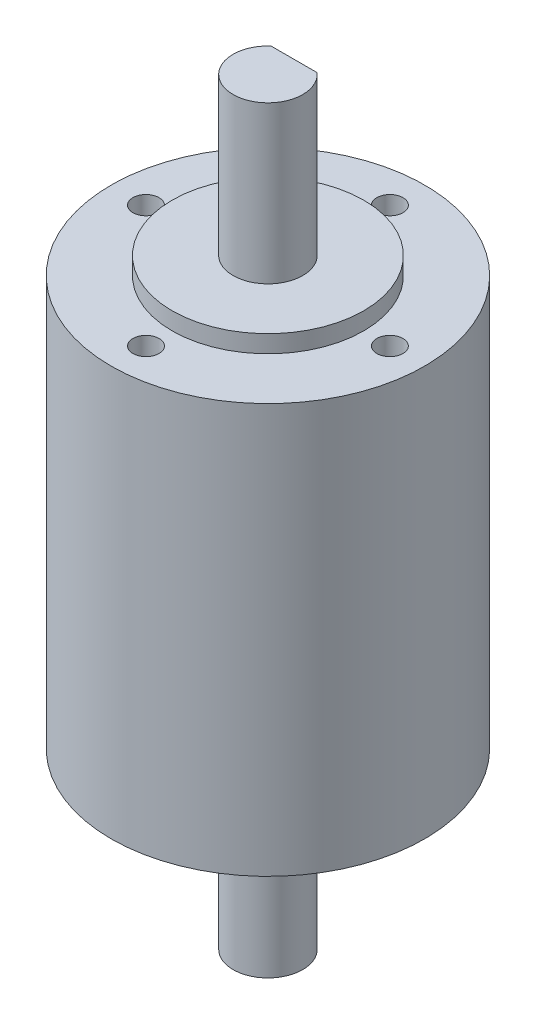
ISO-10303-21;
HEADER;
FILE_DESCRIPTION(('STEP AP214'),'2;1');
FILE_NAME('part.step','',(''),(''),'','','');
FILE_SCHEMA(('AUTOMOTIVE_DESIGN { 1 0 10303 214 1 1 1 1 }'));
ENDSEC;
DATA;
#1=APPLICATION_CONTEXT('core data for automotive mechanical design processes');
#2=APPLICATION_PROTOCOL_DEFINITION('international standard','automotive_design',2000,#1);
#3=PRODUCT_CONTEXT('',#1,'mechanical');
#4=PRODUCT('Part','Part','',(#3));
#5=PRODUCT_RELATED_PRODUCT_CATEGORY('part','',(#4));
#6=PRODUCT_DEFINITION_FORMATION('','',#4);
#7=PRODUCT_DEFINITION_CONTEXT('part definition',#1,'design');
#8=PRODUCT_DEFINITION('design','',#6,#7);
#9=PRODUCT_DEFINITION_SHAPE('','',#8);
#10=(LENGTH_UNIT() NAMED_UNIT(*) SI_UNIT(.MILLI.,.METRE.));
#11=(NAMED_UNIT(*) PLANE_ANGLE_UNIT() SI_UNIT($,.RADIAN.));
#12=(NAMED_UNIT(*) SI_UNIT($,.STERADIAN.) SOLID_ANGLE_UNIT());
#13=UNCERTAINTY_MEASURE_WITH_UNIT(LENGTH_MEASURE(1.E-05),#10,'distance_accuracy_value','');
#14=(GEOMETRIC_REPRESENTATION_CONTEXT(3) GLOBAL_UNCERTAINTY_ASSIGNED_CONTEXT((#13)) GLOBAL_UNIT_ASSIGNED_CONTEXT((#10,
#11,#12)) REPRESENTATION_CONTEXT('',''));
#15=CARTESIAN_POINT('',(0.,0.,0.));
#16=DIRECTION('',(0.,0.,1.));
#17=DIRECTION('',(1.,0.,0.));
#18=AXIS2_PLACEMENT_3D('',#15,#16,#17);
#19=CARTESIAN_POINT('',(0.,47.,0.));
#20=DIRECTION('',(0.,-1.,0.));
#21=DIRECTION('',(0.,0.,-1.));
#22=AXIS2_PLACEMENT_3D('',#19,#20,#21);
#23=CYLINDRICAL_SURFACE('',#22,18.);
#24=CARTESIAN_POINT('',(0.,47.,0.));
#25=DIRECTION('',(0.,1.,0.));
#26=DIRECTION('',(0.,0.,1.));
#27=AXIS2_PLACEMENT_3D('',#24,#25,#26);
#28=CIRCLE('',#27,18.);
#29=CARTESIAN_POINT('',(0.,47.,18.));
#30=VERTEX_POINT('',#29);
#31=EDGE_CURVE('E126',#30,#30,#28,.T.);
#32=ORIENTED_EDGE('',*,*,#31,.F.);
#33=EDGE_LOOP('',(#32));
#34=FACE_BOUND('',#33,.T.);
#35=CARTESIAN_POINT('',(0.,0.,0.));
#36=DIRECTION('',(0.,1.,0.));
#37=DIRECTION('',(0.,0.,1.));
#38=AXIS2_PLACEMENT_3D('',#35,#36,#37);
#39=CIRCLE('',#38,18.);
#40=CARTESIAN_POINT('',(0.,0.,18.));
#41=VERTEX_POINT('',#40);
#42=EDGE_CURVE('E122',#41,#41,#39,.T.);
#43=ORIENTED_EDGE('',*,*,#42,.T.);
#44=EDGE_LOOP('',(#43));
#45=FACE_BOUND('',#44,.T.);
#46=ADVANCED_FACE('F38',(#34,#45),#23,.T.);
#47=CARTESIAN_POINT('',(0.,47.,0.));
#48=DIRECTION('',(0.,1.,0.));
#49=DIRECTION('',(0.,0.,1.));
#50=AXIS2_PLACEMENT_3D('',#47,#48,#49);
#51=PLANE('',#50);
#52=CARTESIAN_POINT('',(-14.,47.,0.));
#53=DIRECTION('',(0.,1.,0.));
#54=DIRECTION('',(0.,0.,1.));
#55=AXIS2_PLACEMENT_3D('',#52,#53,#54);
#56=CIRCLE('',#55,1.5);
#57=CARTESIAN_POINT('',(-14.,47.,1.5));
#58=VERTEX_POINT('',#57);
#59=EDGE_CURVE('E185',#58,#58,#56,.T.);
#60=ORIENTED_EDGE('',*,*,#59,.F.);
#61=EDGE_LOOP('',(#60));
#62=FACE_BOUND('',#61,.T.);
#63=CARTESIAN_POINT('',(0.,47.,-14.));
#64=DIRECTION('',(0.,1.,0.));
#65=DIRECTION('',(0.,0.,1.));
#66=AXIS2_PLACEMENT_3D('',#63,#64,#65);
#67=CIRCLE('',#66,1.5);
#68=CARTESIAN_POINT('',(0.,47.,-12.5));
#69=VERTEX_POINT('',#68);
#70=EDGE_CURVE('E350',#69,#69,#67,.T.);
#71=ORIENTED_EDGE('',*,*,#70,.F.);
#72=EDGE_LOOP('',(#71));
#73=FACE_BOUND('',#72,.T.);
#74=CARTESIAN_POINT('',(14.,47.,0.));
#75=DIRECTION('',(0.,1.,0.));
#76=DIRECTION('',(0.,0.,1.));
#77=AXIS2_PLACEMENT_3D('',#74,#75,#76);
#78=CIRCLE('',#77,1.5);
#79=CARTESIAN_POINT('',(14.,47.,1.5));
#80=VERTEX_POINT('',#79);
#81=EDGE_CURVE('E169',#80,#80,#78,.T.);
#82=ORIENTED_EDGE('',*,*,#81,.F.);
#83=EDGE_LOOP('',(#82));
#84=FACE_BOUND('',#83,.T.);
#85=CARTESIAN_POINT('',(0.,47.,14.));
#86=DIRECTION('',(0.,1.,0.));
#87=DIRECTION('',(0.,0.,1.));
#88=AXIS2_PLACEMENT_3D('',#85,#86,#87);
#89=CIRCLE('',#88,1.5);
#90=CARTESIAN_POINT('',(0.,47.,15.5));
#91=VERTEX_POINT('',#90);
#92=EDGE_CURVE('E181',#91,#91,#89,.T.);
#93=ORIENTED_EDGE('',*,*,#92,.F.);
#94=EDGE_LOOP('',(#93));
#95=FACE_BOUND('',#94,.T.);
#96=CARTESIAN_POINT('',(0.,47.,0.));
#97=DIRECTION('',(0.,1.,0.));
#98=DIRECTION('',(0.,0.,1.));
#99=AXIS2_PLACEMENT_3D('',#96,#97,#98);
#100=CIRCLE('',#99,11.);
#101=CARTESIAN_POINT('',(0.,47.,11.));
#102=VERTEX_POINT('',#101);
#103=EDGE_CURVE('E118',#102,#102,#100,.T.);
#104=ORIENTED_EDGE('',*,*,#103,.F.);
#105=EDGE_LOOP('',(#104));
#106=FACE_BOUND('',#105,.T.);
#107=ORIENTED_EDGE('',*,*,#31,.T.);
#108=EDGE_LOOP('',(#107));
#109=FACE_BOUND('',#108,.T.);
#110=ADVANCED_FACE('F229',(#62,#73,#84,#95,#106,#109),#51,.T.);
#111=CARTESIAN_POINT('',(0.,0.,0.));
#112=DIRECTION('',(0.,1.,0.));
#113=DIRECTION('',(0.,0.,1.));
#114=AXIS2_PLACEMENT_3D('',#111,#112,#113);
#115=PLANE('',#114);
#116=CARTESIAN_POINT('',(0.,0.,14.));
#117=DIRECTION('',(0.,-1.,0.));
#118=DIRECTION('',(0.,0.,-1.));
#119=AXIS2_PLACEMENT_3D('',#116,#117,#118);
#120=CIRCLE('',#119,1.5);
#121=CARTESIAN_POINT('',(0.,0.,12.5));
#122=VERTEX_POINT('',#121);
#123=EDGE_CURVE('E163',#122,#122,#120,.T.);
#124=ORIENTED_EDGE('',*,*,#123,.F.);
#125=EDGE_LOOP('',(#124));
#126=FACE_BOUND('',#125,.T.);
#127=CARTESIAN_POINT('',(14.,0.,0.));
#128=DIRECTION('',(0.,-1.,0.));
#129=DIRECTION('',(0.,0.,-1.));
#130=AXIS2_PLACEMENT_3D('',#127,#128,#129);
#131=CIRCLE('',#130,1.5);
#132=CARTESIAN_POINT('',(14.,0.,-1.5));
#133=VERTEX_POINT('',#132);
#134=EDGE_CURVE('E192',#133,#133,#131,.T.);
#135=ORIENTED_EDGE('',*,*,#134,.F.);
#136=EDGE_LOOP('',(#135));
#137=FACE_BOUND('',#136,.T.);
#138=CARTESIAN_POINT('',(0.,0.,-14.));
#139=DIRECTION('',(0.,-1.,0.));
#140=DIRECTION('',(0.,0.,-1.));
#141=AXIS2_PLACEMENT_3D('',#138,#139,#140);
#142=CIRCLE('',#141,1.5);
#143=CARTESIAN_POINT('',(0.,0.,-15.5));
#144=VERTEX_POINT('',#143);
#145=EDGE_CURVE('E175',#144,#144,#142,.T.);
#146=ORIENTED_EDGE('',*,*,#145,.F.);
#147=EDGE_LOOP('',(#146));
#148=FACE_BOUND('',#147,.T.);
#149=CARTESIAN_POINT('',(-14.,0.,0.));
#150=DIRECTION('',(0.,-1.,0.));
#151=DIRECTION('',(0.,0.,-1.));
#152=AXIS2_PLACEMENT_3D('',#149,#150,#151);
#153=CIRCLE('',#152,1.5);
#154=CARTESIAN_POINT('',(-14.,0.,-1.5));
#155=VERTEX_POINT('',#154);
#156=EDGE_CURVE('E161',#155,#155,#153,.T.);
#157=ORIENTED_EDGE('',*,*,#156,.F.);
#158=EDGE_LOOP('',(#157));
#159=FACE_BOUND('',#158,.T.);
#160=CARTESIAN_POINT('',(0.,0.,0.));
#161=DIRECTION('',(0.,-1.,0.));
#162=DIRECTION('',(0.,0.,-1.));
#163=AXIS2_PLACEMENT_3D('',#160,#161,#162);
#164=CIRCLE('',#163,11.);
#165=CARTESIAN_POINT('',(0.,0.,-11.));
#166=VERTEX_POINT('',#165);
#167=EDGE_CURVE('E113',#166,#166,#164,.T.);
#168=ORIENTED_EDGE('',*,*,#167,.F.);
#169=EDGE_LOOP('',(#168));
#170=FACE_BOUND('',#169,.T.);
#171=ORIENTED_EDGE('',*,*,#42,.F.);
#172=EDGE_LOOP('',(#171));
#173=FACE_BOUND('',#172,.T.);
#174=ADVANCED_FACE('F225',(#126,#137,#148,#159,#170,#173),#115,.F.);
#175=CARTESIAN_POINT('',(0.,49.,0.));
#176=DIRECTION('',(0.,-1.,0.));
#177=DIRECTION('',(0.,0.,-1.));
#178=AXIS2_PLACEMENT_3D('',#175,#176,#177);
#179=CYLINDRICAL_SURFACE('',#178,11.);
#180=CARTESIAN_POINT('',(0.,49.,0.));
#181=DIRECTION('',(0.,1.,0.));
#182=DIRECTION('',(0.,0.,1.));
#183=AXIS2_PLACEMENT_3D('',#180,#181,#182);
#184=CIRCLE('',#183,11.);
#185=CARTESIAN_POINT('',(0.,49.,11.));
#186=VERTEX_POINT('',#185);
#187=EDGE_CURVE('E103',#186,#186,#184,.T.);
#188=ORIENTED_EDGE('',*,*,#187,.F.);
#189=EDGE_LOOP('',(#188));
#190=FACE_BOUND('',#189,.T.);
#191=ORIENTED_EDGE('',*,*,#103,.T.);
#192=EDGE_LOOP('',(#191));
#193=FACE_BOUND('',#192,.T.);
#194=ADVANCED_FACE('F228',(#190,#193),#179,.T.);
#195=CARTESIAN_POINT('',(0.,49.,0.));
#196=DIRECTION('',(0.,1.,0.));
#197=DIRECTION('',(0.,0.,1.));
#198=AXIS2_PLACEMENT_3D('',#195,#196,#197);
#199=PLANE('',#198);
#200=CARTESIAN_POINT('',(0.,49.,0.));
#201=DIRECTION('',(0.,1.,0.));
#202=DIRECTION('',(0.,0.,1.));
#203=AXIS2_PLACEMENT_3D('',#200,#201,#202);
#204=CIRCLE('',#203,4.);
#205=CARTESIAN_POINT('',(0.,49.,4.));
#206=VERTEX_POINT('',#205);
#207=EDGE_CURVE('E109',#206,#206,#204,.T.);
#208=ORIENTED_EDGE('',*,*,#207,.F.);
#209=EDGE_LOOP('',(#208));
#210=FACE_BOUND('',#209,.T.);
#211=ORIENTED_EDGE('',*,*,#187,.T.);
#212=EDGE_LOOP('',(#211));
#213=FACE_BOUND('',#212,.T.);
#214=ADVANCED_FACE('F255',(#210,#213),#199,.T.);
#215=CARTESIAN_POINT('',(0.,-2.,0.));
#216=DIRECTION('',(0.,1.,0.));
#217=DIRECTION('',(0.,0.,1.));
#218=AXIS2_PLACEMENT_3D('',#215,#216,#217);
#219=CYLINDRICAL_SURFACE('',#218,11.);
#220=CARTESIAN_POINT('',(0.,-2.,0.));
#221=DIRECTION('',(0.,-1.,0.));
#222=DIRECTION('',(0.,0.,-1.));
#223=AXIS2_PLACEMENT_3D('',#220,#221,#222);
#224=CIRCLE('',#223,11.);
#225=CARTESIAN_POINT('',(0.,-2.,-11.));
#226=VERTEX_POINT('',#225);
#227=EDGE_CURVE('E96',#226,#226,#224,.T.);
#228=ORIENTED_EDGE('',*,*,#227,.F.);
#229=EDGE_LOOP('',(#228));
#230=FACE_BOUND('',#229,.T.);
#231=ORIENTED_EDGE('',*,*,#167,.T.);
#232=EDGE_LOOP('',(#231));
#233=FACE_BOUND('',#232,.T.);
#234=ADVANCED_FACE('F259',(#230,#233),#219,.T.);
#235=CARTESIAN_POINT('',(0.,-2.,0.));
#236=DIRECTION('',(0.,-1.,0.));
#237=DIRECTION('',(0.,0.,-1.));
#238=AXIS2_PLACEMENT_3D('',#235,#236,#237);
#239=PLANE('',#238);
#240=CARTESIAN_POINT('',(0.,-2.,0.));
#241=DIRECTION('',(0.,-1.,0.));
#242=DIRECTION('',(0.,0.,-1.));
#243=AXIS2_PLACEMENT_3D('',#240,#241,#242);
#244=CIRCLE('',#243,4.);
#245=CARTESIAN_POINT('',(0.,-2.,-4.));
#246=VERTEX_POINT('',#245);
#247=EDGE_CURVE('E110',#246,#246,#244,.T.);
#248=ORIENTED_EDGE('',*,*,#247,.F.);
#249=EDGE_LOOP('',(#248));
#250=FACE_BOUND('',#249,.T.);
#251=ORIENTED_EDGE('',*,*,#227,.T.);
#252=EDGE_LOOP('',(#251));
#253=FACE_BOUND('',#252,.T.);
#254=ADVANCED_FACE('F263',(#250,#253),#239,.T.);
#255=CARTESIAN_POINT('',(0.,-20.,0.));
#256=DIRECTION('',(0.,1.,0.));
#257=DIRECTION('',(0.,0.,1.));
#258=AXIS2_PLACEMENT_3D('',#255,#256,#257);
#259=CYLINDRICAL_SURFACE('',#258,4.);
#260=CARTESIAN_POINT('',(0.,-20.,0.));
#261=DIRECTION('',(0.,-1.,0.));
#262=DIRECTION('',(0.,0.,-1.));
#263=AXIS2_PLACEMENT_3D('',#260,#261,#262);
#264=CIRCLE('',#263,4.);
#265=CARTESIAN_POINT('',(2.64575131106459,-20.,-3.));
#266=VERTEX_POINT('',#265);
#267=CARTESIAN_POINT('',(-2.64575131106459,-20.,-3.));
#268=VERTEX_POINT('',#267);
#269=EDGE_CURVE('E90',#266,#268,#264,.T.);
#270=ORIENTED_EDGE('',*,*,#269,.F.);
#271=DIRECTION('',(0.,1.,0.));
#272=VECTOR('',#271,1.);
#273=CARTESIAN_POINT('',(2.64575131106459,-20.,-3.));
#274=LINE('',#273,#272);
#275=CARTESIAN_POINT('',(2.64575131106459,-5.,-3.));
#276=VERTEX_POINT('',#275);
#277=EDGE_CURVE('E53',#266,#276,#274,.T.);
#278=ORIENTED_EDGE('',*,*,#277,.T.);
#279=CARTESIAN_POINT('',(0.,-5.,0.));
#280=DIRECTION('',(0.,-1.,0.));
#281=DIRECTION('',(0.,0.,-1.));
#282=AXIS2_PLACEMENT_3D('',#279,#280,#281);
#283=CIRCLE('',#282,4.);
#284=CARTESIAN_POINT('',(-2.64575131106459,-5.,-3.));
#285=VERTEX_POINT('',#284);
#286=EDGE_CURVE('E11',#285,#276,#283,.T.);
#287=ORIENTED_EDGE('',*,*,#286,.F.);
#288=DIRECTION('',(0.,1.,0.));
#289=VECTOR('',#288,1.);
#290=CARTESIAN_POINT('',(-2.64575131106459,-20.,-3.));
#291=LINE('',#290,#289);
#292=EDGE_CURVE('E79',#285,#268,#291,.F.);
#293=ORIENTED_EDGE('',*,*,#292,.T.);
#294=EDGE_LOOP('',(#270,#278,#287,#293));
#295=FACE_BOUND('',#294,.T.);
#296=ORIENTED_EDGE('',*,*,#247,.T.);
#297=EDGE_LOOP('',(#296));
#298=FACE_BOUND('',#297,.T.);
#299=ADVANCED_FACE('F88',(#295,#298),#259,.T.);
#300=CARTESIAN_POINT('',(0.,-20.,0.));
#301=DIRECTION('',(0.,-1.,0.));
#302=DIRECTION('',(0.,0.,-1.));
#303=AXIS2_PLACEMENT_3D('',#300,#301,#302);
#304=PLANE('',#303);
#305=DIRECTION('',(-1.,0.,0.));
#306=VECTOR('',#305,1.);
#307=CARTESIAN_POINT('',(0.,-20.,-3.));
#308=LINE('',#307,#306);
#309=EDGE_CURVE('E46',#266,#268,#308,.T.);
#310=ORIENTED_EDGE('',*,*,#309,.F.);
#311=ORIENTED_EDGE('',*,*,#269,.T.);
#312=EDGE_LOOP('',(#310,#311));
#313=FACE_BOUND('',#312,.T.);
#314=ADVANCED_FACE('F94',(#313),#304,.T.);
#315=CARTESIAN_POINT('',(0.,67.,0.));
#316=DIRECTION('',(0.,-1.,0.));
#317=DIRECTION('',(0.,0.,-1.));
#318=AXIS2_PLACEMENT_3D('',#315,#316,#317);
#319=CYLINDRICAL_SURFACE('',#318,4.);
#320=CARTESIAN_POINT('',(0.,67.,0.));
#321=DIRECTION('',(0.,1.,0.));
#322=DIRECTION('',(0.,0.,1.));
#323=AXIS2_PLACEMENT_3D('',#320,#321,#322);
#324=CIRCLE('',#323,4.);
#325=CARTESIAN_POINT('',(-2.64575131106459,67.,-3.));
#326=VERTEX_POINT('',#325);
#327=CARTESIAN_POINT('',(2.64575131106459,67.,-3.));
#328=VERTEX_POINT('',#327);
#329=EDGE_CURVE('E97',#326,#328,#324,.T.);
#330=ORIENTED_EDGE('',*,*,#329,.F.);
#331=DIRECTION('',(0.,-1.,0.));
#332=VECTOR('',#331,1.);
#333=CARTESIAN_POINT('',(-2.64575131106459,67.,-3.));
#334=LINE('',#333,#332);
#335=CARTESIAN_POINT('',(-2.64575131106459,52.,-3.));
#336=VERTEX_POINT('',#335);
#337=EDGE_CURVE('E61',#326,#336,#334,.T.);
#338=ORIENTED_EDGE('',*,*,#337,.T.);
#339=CARTESIAN_POINT('',(0.,52.,0.));
#340=DIRECTION('',(0.,-1.,0.));
#341=DIRECTION('',(0.,0.,-1.));
#342=AXIS2_PLACEMENT_3D('',#339,#340,#341);
#343=CIRCLE('',#342,4.);
#344=CARTESIAN_POINT('',(2.64575131106459,52.,-3.));
#345=VERTEX_POINT('',#344);
#346=EDGE_CURVE('E85',#336,#345,#343,.T.);
#347=ORIENTED_EDGE('',*,*,#346,.T.);
#348=DIRECTION('',(0.,-1.,0.));
#349=VECTOR('',#348,1.);
#350=CARTESIAN_POINT('',(2.64575131106459,67.,-3.));
#351=LINE('',#350,#349);
#352=EDGE_CURVE('E145',#345,#328,#351,.F.);
#353=ORIENTED_EDGE('',*,*,#352,.T.);
#354=EDGE_LOOP('',(#330,#338,#347,#353));
#355=FACE_BOUND('',#354,.T.);
#356=ORIENTED_EDGE('',*,*,#207,.T.);
#357=EDGE_LOOP('',(#356));
#358=FACE_BOUND('',#357,.T.);
#359=ADVANCED_FACE('F143',(#355,#358),#319,.T.);
#360=CARTESIAN_POINT('',(0.,67.,0.));
#361=DIRECTION('',(0.,1.,0.));
#362=DIRECTION('',(0.,0.,1.));
#363=AXIS2_PLACEMENT_3D('',#360,#361,#362);
#364=PLANE('',#363);
#365=DIRECTION('',(1.,0.,0.));
#366=VECTOR('',#365,1.);
#367=CARTESIAN_POINT('',(0.,67.,-3.));
#368=LINE('',#367,#366);
#369=EDGE_CURVE('E133',#326,#328,#368,.T.);
#370=ORIENTED_EDGE('',*,*,#369,.F.);
#371=ORIENTED_EDGE('',*,*,#329,.T.);
#372=EDGE_LOOP('',(#370,#371));
#373=FACE_BOUND('',#372,.T.);
#374=ADVANCED_FACE('F274',(#373),#364,.T.);
#375=CARTESIAN_POINT('',(0.,52.,0.));
#376=DIRECTION('',(0.,-1.,0.));
#377=DIRECTION('',(0.,0.,-1.));
#378=AXIS2_PLACEMENT_3D('',#375,#376,#377);
#379=PLANE('',#378);
#380=DIRECTION('',(1.,0.,0.));
#381=VECTOR('',#380,1.);
#382=CARTESIAN_POINT('',(-4.7940074906367,52.,-3.));
#383=LINE('',#382,#381);
#384=EDGE_CURVE('E149',#336,#345,#383,.T.);
#385=ORIENTED_EDGE('',*,*,#384,.T.);
#386=ORIENTED_EDGE('',*,*,#346,.F.);
#387=EDGE_LOOP('',(#385,#386));
#388=FACE_BOUND('',#387,.T.);
#389=ADVANCED_FACE('F148',(#388),#379,.F.);
#390=CARTESIAN_POINT('',(-4.7940074906367,52.,-3.));
#391=DIRECTION('',(0.,0.,1.));
#392=DIRECTION('',(1.,0.,0.));
#393=AXIS2_PLACEMENT_3D('',#390,#391,#392);
#394=PLANE('',#393);
#395=ORIENTED_EDGE('',*,*,#369,.T.);
#396=ORIENTED_EDGE('',*,*,#352,.F.);
#397=ORIENTED_EDGE('',*,*,#384,.F.);
#398=ORIENTED_EDGE('',*,*,#337,.F.);
#399=EDGE_LOOP('',(#395,#396,#397,#398));
#400=FACE_BOUND('',#399,.T.);
#401=ADVANCED_FACE('F150',(#400),#394,.F.);
#402=CARTESIAN_POINT('',(0.,-5.,0.));
#403=DIRECTION('',(0.,-1.,0.));
#404=DIRECTION('',(0.,0.,-1.));
#405=AXIS2_PLACEMENT_3D('',#402,#403,#404);
#406=PLANE('',#405);
#407=ORIENTED_EDGE('',*,*,#286,.T.);
#408=DIRECTION('',(-1.,0.,0.));
#409=VECTOR('',#408,1.);
#410=CARTESIAN_POINT('',(4.45842696629214,-5.,-3.));
#411=LINE('',#410,#409);
#412=EDGE_CURVE('E92',#276,#285,#411,.T.);
#413=ORIENTED_EDGE('',*,*,#412,.T.);
#414=EDGE_LOOP('',(#407,#413));
#415=FACE_BOUND('',#414,.T.);
#416=ADVANCED_FACE('F280',(#415),#406,.T.);
#417=CARTESIAN_POINT('',(4.45842696629214,-5.,-3.));
#418=DIRECTION('',(0.,0.,1.));
#419=DIRECTION('',(1.,0.,0.));
#420=AXIS2_PLACEMENT_3D('',#417,#418,#419);
#421=PLANE('',#420);
#422=ORIENTED_EDGE('',*,*,#309,.T.);
#423=ORIENTED_EDGE('',*,*,#292,.F.);
#424=ORIENTED_EDGE('',*,*,#412,.F.);
#425=ORIENTED_EDGE('',*,*,#277,.F.);
#426=EDGE_LOOP('',(#422,#423,#424,#425));
#427=FACE_BOUND('',#426,.T.);
#428=ADVANCED_FACE('F78',(#427),#421,.F.);
#429=CARTESIAN_POINT('',(-14.,6.,0.));
#430=DIRECTION('',(0.,-1.,0.));
#431=DIRECTION('',(0.,0.,-1.));
#432=AXIS2_PLACEMENT_3D('',#429,#430,#431);
#433=CYLINDRICAL_SURFACE('',#432,1.5);
#434=CARTESIAN_POINT('',(-14.,6.,0.));
#435=DIRECTION('',(0.,-1.,0.));
#436=DIRECTION('',(0.,0.,-1.));
#437=AXIS2_PLACEMENT_3D('',#434,#435,#436);
#438=CIRCLE('',#437,1.5);
#439=CARTESIAN_POINT('',(-14.,6.,-1.5));
#440=VERTEX_POINT('',#439);
#441=EDGE_CURVE('E179',#440,#440,#438,.T.);
#442=ORIENTED_EDGE('',*,*,#441,.F.);
#443=EDGE_LOOP('',(#442));
#444=FACE_BOUND('',#443,.T.);
#445=ORIENTED_EDGE('',*,*,#156,.T.);
#446=EDGE_LOOP('',(#445));
#447=FACE_BOUND('',#446,.T.);
#448=ADVANCED_FACE('F285',(#444,#447),#433,.F.);
#449=CARTESIAN_POINT('',(-14.,6.,0.));
#450=DIRECTION('',(0.,-1.,0.));
#451=DIRECTION('',(0.,0.,-1.));
#452=AXIS2_PLACEMENT_3D('',#449,#450,#451);
#453=PLANE('',#452);
#454=ORIENTED_EDGE('',*,*,#441,.T.);
#455=EDGE_LOOP('',(#454));
#456=FACE_BOUND('',#455,.T.);
#457=ADVANCED_FACE('F290',(#456),#453,.T.);
#458=CARTESIAN_POINT('',(0.,6.,-14.));
#459=DIRECTION('',(0.,-1.,0.));
#460=DIRECTION('',(0.,0.,-1.));
#461=AXIS2_PLACEMENT_3D('',#458,#459,#460);
#462=CYLINDRICAL_SURFACE('',#461,1.5);
#463=CARTESIAN_POINT('',(0.,6.,-14.));
#464=DIRECTION('',(0.,-1.,0.));
#465=DIRECTION('',(0.,0.,-1.));
#466=AXIS2_PLACEMENT_3D('',#463,#464,#465);
#467=CIRCLE('',#466,1.5);
#468=CARTESIAN_POINT('',(0.,6.,-15.5));
#469=VERTEX_POINT('',#468);
#470=EDGE_CURVE('E178',#469,#469,#467,.T.);
#471=ORIENTED_EDGE('',*,*,#470,.F.);
#472=EDGE_LOOP('',(#471));
#473=FACE_BOUND('',#472,.T.);
#474=ORIENTED_EDGE('',*,*,#145,.T.);
#475=EDGE_LOOP('',(#474));
#476=FACE_BOUND('',#475,.T.);
#477=ADVANCED_FACE('F294',(#473,#476),#462,.F.);
#478=CARTESIAN_POINT('',(0.,6.,-14.));
#479=DIRECTION('',(0.,-1.,0.));
#480=DIRECTION('',(0.,0.,-1.));
#481=AXIS2_PLACEMENT_3D('',#478,#479,#480);
#482=PLANE('',#481);
#483=ORIENTED_EDGE('',*,*,#470,.T.);
#484=EDGE_LOOP('',(#483));
#485=FACE_BOUND('',#484,.T.);
#486=ADVANCED_FACE('F221',(#485),#482,.T.);
#487=CARTESIAN_POINT('',(14.,6.,0.));
#488=DIRECTION('',(0.,-1.,0.));
#489=DIRECTION('',(0.,0.,-1.));
#490=AXIS2_PLACEMENT_3D('',#487,#488,#489);
#491=CYLINDRICAL_SURFACE('',#490,1.5);
#492=CARTESIAN_POINT('',(14.,6.,0.));
#493=DIRECTION('',(0.,-1.,0.));
#494=DIRECTION('',(0.,0.,-1.));
#495=AXIS2_PLACEMENT_3D('',#492,#493,#494);
#496=CIRCLE('',#495,1.5);
#497=CARTESIAN_POINT('',(14.,6.,-1.5));
#498=VERTEX_POINT('',#497);
#499=EDGE_CURVE('E167',#498,#498,#496,.T.);
#500=ORIENTED_EDGE('',*,*,#499,.F.);
#501=EDGE_LOOP('',(#500));
#502=FACE_BOUND('',#501,.T.);
#503=ORIENTED_EDGE('',*,*,#134,.T.);
#504=EDGE_LOOP('',(#503));
#505=FACE_BOUND('',#504,.T.);
#506=ADVANCED_FACE('F218',(#502,#505),#491,.F.);
#507=CARTESIAN_POINT('',(14.,6.,0.));
#508=DIRECTION('',(0.,-1.,0.));
#509=DIRECTION('',(0.,0.,-1.));
#510=AXIS2_PLACEMENT_3D('',#507,#508,#509);
#511=PLANE('',#510);
#512=ORIENTED_EDGE('',*,*,#499,.T.);
#513=EDGE_LOOP('',(#512));
#514=FACE_BOUND('',#513,.T.);
#515=ADVANCED_FACE('F216',(#514),#511,.T.);
#516=CARTESIAN_POINT('',(0.,6.,14.));
#517=DIRECTION('',(0.,-1.,0.));
#518=DIRECTION('',(0.,0.,-1.));
#519=AXIS2_PLACEMENT_3D('',#516,#517,#518);
#520=CYLINDRICAL_SURFACE('',#519,1.5);
#521=CARTESIAN_POINT('',(0.,6.,14.));
#522=DIRECTION('',(0.,-1.,0.));
#523=DIRECTION('',(0.,0.,-1.));
#524=AXIS2_PLACEMENT_3D('',#521,#522,#523);
#525=CIRCLE('',#524,1.5);
#526=CARTESIAN_POINT('',(0.,6.,12.5));
#527=VERTEX_POINT('',#526);
#528=EDGE_CURVE('E166',#527,#527,#525,.T.);
#529=ORIENTED_EDGE('',*,*,#528,.F.);
#530=EDGE_LOOP('',(#529));
#531=FACE_BOUND('',#530,.T.);
#532=ORIENTED_EDGE('',*,*,#123,.T.);
#533=EDGE_LOOP('',(#532));
#534=FACE_BOUND('',#533,.T.);
#535=ADVANCED_FACE('F303',(#531,#534),#520,.F.);
#536=CARTESIAN_POINT('',(0.,6.,14.));
#537=DIRECTION('',(0.,-1.,0.));
#538=DIRECTION('',(0.,0.,-1.));
#539=AXIS2_PLACEMENT_3D('',#536,#537,#538);
#540=PLANE('',#539);
#541=ORIENTED_EDGE('',*,*,#528,.T.);
#542=EDGE_LOOP('',(#541));
#543=FACE_BOUND('',#542,.T.);
#544=ADVANCED_FACE('F306',(#543),#540,.T.);
#545=CARTESIAN_POINT('',(0.,41.,14.));
#546=DIRECTION('',(0.,1.,0.));
#547=DIRECTION('',(0.,0.,1.));
#548=AXIS2_PLACEMENT_3D('',#545,#546,#547);
#549=CYLINDRICAL_SURFACE('',#548,1.5);
#550=CARTESIAN_POINT('',(0.,41.,14.));
#551=DIRECTION('',(0.,1.,0.));
#552=DIRECTION('',(0.,0.,1.));
#553=AXIS2_PLACEMENT_3D('',#550,#551,#552);
#554=CIRCLE('',#553,1.5);
#555=CARTESIAN_POINT('',(0.,41.,15.5));
#556=VERTEX_POINT('',#555);
#557=EDGE_CURVE('E173',#556,#556,#554,.T.);
#558=ORIENTED_EDGE('',*,*,#557,.F.);
#559=EDGE_LOOP('',(#558));
#560=FACE_BOUND('',#559,.T.);
#561=ORIENTED_EDGE('',*,*,#92,.T.);
#562=EDGE_LOOP('',(#561));
#563=FACE_BOUND('',#562,.T.);
#564=ADVANCED_FACE('F310',(#560,#563),#549,.F.);
#565=CARTESIAN_POINT('',(0.,41.,14.));
#566=DIRECTION('',(0.,1.,0.));
#567=DIRECTION('',(0.,0.,1.));
#568=AXIS2_PLACEMENT_3D('',#565,#566,#567);
#569=PLANE('',#568);
#570=ORIENTED_EDGE('',*,*,#557,.T.);
#571=EDGE_LOOP('',(#570));
#572=FACE_BOUND('',#571,.T.);
#573=ADVANCED_FACE('F313',(#572),#569,.T.);
#574=CARTESIAN_POINT('',(14.,41.,0.));
#575=DIRECTION('',(0.,1.,0.));
#576=DIRECTION('',(0.,0.,1.));
#577=AXIS2_PLACEMENT_3D('',#574,#575,#576);
#578=CYLINDRICAL_SURFACE('',#577,1.5);
#579=CARTESIAN_POINT('',(14.,41.,0.));
#580=DIRECTION('',(0.,1.,0.));
#581=DIRECTION('',(0.,0.,1.));
#582=AXIS2_PLACEMENT_3D('',#579,#580,#581);
#583=CIRCLE('',#582,1.5);
#584=CARTESIAN_POINT('',(14.,41.,1.5));
#585=VERTEX_POINT('',#584);
#586=EDGE_CURVE('E172',#585,#585,#583,.T.);
#587=ORIENTED_EDGE('',*,*,#586,.F.);
#588=EDGE_LOOP('',(#587));
#589=FACE_BOUND('',#588,.T.);
#590=ORIENTED_EDGE('',*,*,#81,.T.);
#591=EDGE_LOOP('',(#590));
#592=FACE_BOUND('',#591,.T.);
#593=ADVANCED_FACE('F317',(#589,#592),#578,.F.);
#594=CARTESIAN_POINT('',(14.,41.,0.));
#595=DIRECTION('',(0.,1.,0.));
#596=DIRECTION('',(0.,0.,1.));
#597=AXIS2_PLACEMENT_3D('',#594,#595,#596);
#598=PLANE('',#597);
#599=ORIENTED_EDGE('',*,*,#586,.T.);
#600=EDGE_LOOP('',(#599));
#601=FACE_BOUND('',#600,.T.);
#602=ADVANCED_FACE('F321',(#601),#598,.T.);
#603=CARTESIAN_POINT('',(0.,41.,-14.));
#604=DIRECTION('',(0.,1.,0.));
#605=DIRECTION('',(0.,0.,1.));
#606=AXIS2_PLACEMENT_3D('',#603,#604,#605);
#607=CYLINDRICAL_SURFACE('',#606,1.5);
#608=CARTESIAN_POINT('',(0.,41.,-14.));
#609=DIRECTION('',(0.,1.,0.));
#610=DIRECTION('',(0.,0.,1.));
#611=AXIS2_PLACEMENT_3D('',#608,#609,#610);
#612=CIRCLE('',#611,1.5);
#613=CARTESIAN_POINT('',(0.,41.,-12.5));
#614=VERTEX_POINT('',#613);
#615=EDGE_CURVE('E188',#614,#614,#612,.T.);
#616=ORIENTED_EDGE('',*,*,#615,.F.);
#617=EDGE_LOOP('',(#616));
#618=FACE_BOUND('',#617,.T.);
#619=ORIENTED_EDGE('',*,*,#70,.T.);
#620=EDGE_LOOP('',(#619));
#621=FACE_BOUND('',#620,.T.);
#622=ADVANCED_FACE('F325',(#618,#621),#607,.F.);
#623=CARTESIAN_POINT('',(0.,41.,-14.));
#624=DIRECTION('',(0.,1.,0.));
#625=DIRECTION('',(0.,0.,1.));
#626=AXIS2_PLACEMENT_3D('',#623,#624,#625);
#627=PLANE('',#626);
#628=ORIENTED_EDGE('',*,*,#615,.T.);
#629=EDGE_LOOP('',(#628));
#630=FACE_BOUND('',#629,.T.);
#631=ADVANCED_FACE('F329',(#630),#627,.T.);
#632=CARTESIAN_POINT('',(-14.,41.,0.));
#633=DIRECTION('',(0.,1.,0.));
#634=DIRECTION('',(0.,0.,1.));
#635=AXIS2_PLACEMENT_3D('',#632,#633,#634);
#636=CYLINDRICAL_SURFACE('',#635,1.5);
#637=CARTESIAN_POINT('',(-14.,41.,0.));
#638=DIRECTION('',(0.,1.,0.));
#639=DIRECTION('',(0.,0.,1.));
#640=AXIS2_PLACEMENT_3D('',#637,#638,#639);
#641=CIRCLE('',#640,1.5);
#642=CARTESIAN_POINT('',(-14.,41.,1.5));
#643=VERTEX_POINT('',#642);
#644=EDGE_CURVE('E187',#643,#643,#641,.T.);
#645=ORIENTED_EDGE('',*,*,#644,.F.);
#646=EDGE_LOOP('',(#645));
#647=FACE_BOUND('',#646,.T.);
#648=ORIENTED_EDGE('',*,*,#59,.T.);
#649=EDGE_LOOP('',(#648));
#650=FACE_BOUND('',#649,.T.);
#651=ADVANCED_FACE('F333',(#647,#650),#636,.F.);
#652=CARTESIAN_POINT('',(-14.,41.,0.));
#653=DIRECTION('',(0.,1.,0.));
#654=DIRECTION('',(0.,0.,1.));
#655=AXIS2_PLACEMENT_3D('',#652,#653,#654);
#656=PLANE('',#655);
#657=ORIENTED_EDGE('',*,*,#644,.T.);
#658=EDGE_LOOP('',(#657));
#659=FACE_BOUND('',#658,.T.);
#660=ADVANCED_FACE('F337',(#659),#656,.T.);
#661=CLOSED_SHELL('',(#46,#110,#174,#194,#214,#234,#254,#299,#314,#359,#374,#389,#401,#416,#428,
#448,#457,#477,#486,#506,#515,#535,#544,#564,#573,#593,#602,#622,#631,#651,#660));
#662=MANIFOLD_SOLID_BREP('B2',#661);
#663=ADVANCED_BREP_SHAPE_REPRESENTATION('',(#18,#662),#14);
#664=SHAPE_DEFINITION_REPRESENTATION(#9,#663);
ENDSEC;
END-ISO-10303-21;
